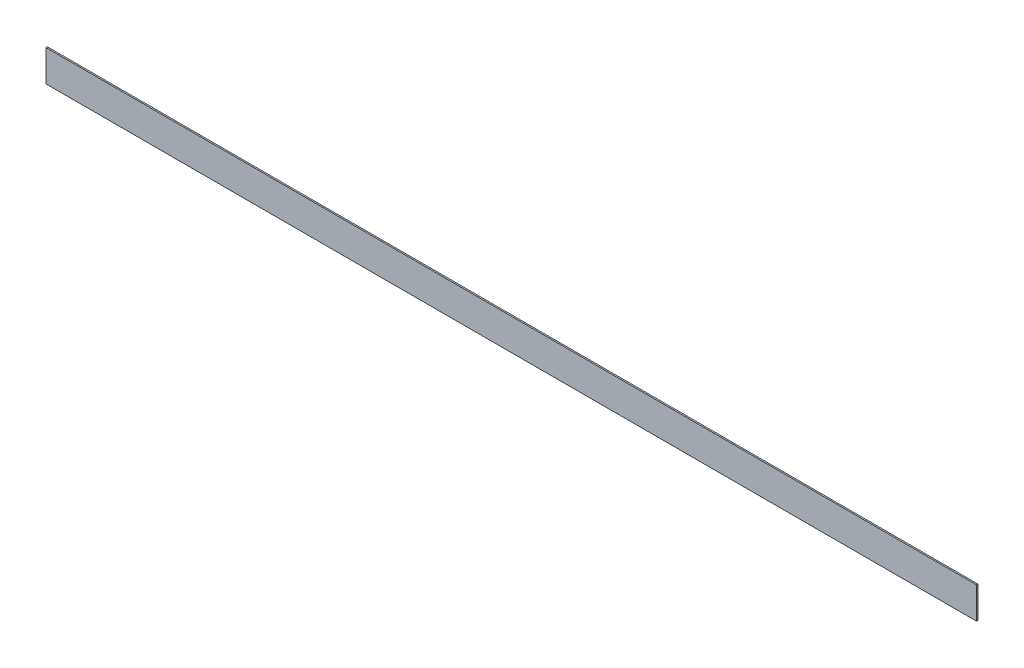
ISO-10303-21;
HEADER;
FILE_DESCRIPTION(('STEP AP214'),'2;1');
FILE_NAME('part.step','',(''),(''),'','','');
FILE_SCHEMA(('AUTOMOTIVE_DESIGN { 1 0 10303 214 1 1 1 1 }'));
ENDSEC;
DATA;
#1=APPLICATION_CONTEXT('core data for automotive mechanical design processes');
#2=APPLICATION_PROTOCOL_DEFINITION('international standard','automotive_design',2000,#1);
#3=PRODUCT_CONTEXT('',#1,'mechanical');
#4=PRODUCT('Part','Part','',(#3));
#5=PRODUCT_RELATED_PRODUCT_CATEGORY('part','',(#4));
#6=PRODUCT_DEFINITION_FORMATION('','',#4);
#7=PRODUCT_DEFINITION_CONTEXT('part definition',#1,'design');
#8=PRODUCT_DEFINITION('design','',#6,#7);
#9=PRODUCT_DEFINITION_SHAPE('','',#8);
#10=(LENGTH_UNIT() NAMED_UNIT(*) SI_UNIT(.MILLI.,.METRE.));
#11=(NAMED_UNIT(*) PLANE_ANGLE_UNIT() SI_UNIT($,.RADIAN.));
#12=(NAMED_UNIT(*) SI_UNIT($,.STERADIAN.) SOLID_ANGLE_UNIT());
#13=UNCERTAINTY_MEASURE_WITH_UNIT(LENGTH_MEASURE(1.E-05),#10,'distance_accuracy_value','');
#14=(GEOMETRIC_REPRESENTATION_CONTEXT(3) GLOBAL_UNCERTAINTY_ASSIGNED_CONTEXT((#13)) GLOBAL_UNIT_ASSIGNED_CONTEXT((#10,
#11,#12)) REPRESENTATION_CONTEXT('',''));
#15=CARTESIAN_POINT('',(0.,0.,0.));
#16=DIRECTION('',(0.,0.,1.));
#17=DIRECTION('',(1.,0.,0.));
#18=AXIS2_PLACEMENT_3D('',#15,#16,#17);
#19=CARTESIAN_POINT('',(665.5,-22.5,2.));
#20=DIRECTION('',(-1.,0.,0.));
#21=DIRECTION('',(0.,0.,1.));
#22=AXIS2_PLACEMENT_3D('',#19,#20,#21);
#23=PLANE('',#22);
#24=DIRECTION('',(0.,1.,0.));
#25=VECTOR('',#24,1.);
#26=CARTESIAN_POINT('',(665.5,-22.5,0.));
#27=LINE('',#26,#25);
#28=CARTESIAN_POINT('',(665.5,-22.5,0.));
#29=VERTEX_POINT('',#28);
#30=CARTESIAN_POINT('',(665.5,22.5,0.));
#31=VERTEX_POINT('',#30);
#32=EDGE_CURVE('E95',#29,#31,#27,.T.);
#33=ORIENTED_EDGE('',*,*,#32,.T.);
#34=DIRECTION('',(0.,0.,-1.));
#35=VECTOR('',#34,1.);
#36=CARTESIAN_POINT('',(665.5,22.5,2.));
#37=LINE('',#36,#35);
#38=CARTESIAN_POINT('',(665.5,22.5,2.));
#39=VERTEX_POINT('',#38);
#40=EDGE_CURVE('E11',#39,#31,#37,.T.);
#41=ORIENTED_EDGE('',*,*,#40,.F.);
#42=DIRECTION('',(0.,1.,0.));
#43=VECTOR('',#42,1.);
#44=CARTESIAN_POINT('',(665.5,-22.5,2.));
#45=LINE('',#44,#43);
#46=CARTESIAN_POINT('',(665.5,-22.5,2.));
#47=VERTEX_POINT('',#46);
#48=EDGE_CURVE('E83',#47,#39,#45,.T.);
#49=ORIENTED_EDGE('',*,*,#48,.F.);
#50=DIRECTION('',(0.,0.,-1.));
#51=VECTOR('',#50,1.);
#52=CARTESIAN_POINT('',(665.5,-22.5,2.));
#53=LINE('',#52,#51);
#54=EDGE_CURVE('E91',#47,#29,#53,.T.);
#55=ORIENTED_EDGE('',*,*,#54,.T.);
#56=EDGE_LOOP('',(#33,#41,#49,#55));
#57=FACE_BOUND('',#56,.T.);
#58=ADVANCED_FACE('F32',(#57),#23,.F.);
#59=CARTESIAN_POINT('',(-665.5,22.5,2.));
#60=DIRECTION('',(0.,-1.,0.));
#61=DIRECTION('',(0.,0.,-1.));
#62=AXIS2_PLACEMENT_3D('',#59,#60,#61);
#63=PLANE('',#62);
#64=DIRECTION('',(-1.,0.,0.));
#65=VECTOR('',#64,1.);
#66=CARTESIAN_POINT('',(-665.5,22.5,0.));
#67=LINE('',#66,#65);
#68=CARTESIAN_POINT('',(-665.5,22.5,0.));
#69=VERTEX_POINT('',#68);
#70=EDGE_CURVE('E87',#31,#69,#67,.T.);
#71=ORIENTED_EDGE('',*,*,#70,.T.);
#72=DIRECTION('',(0.,0.,-1.));
#73=VECTOR('',#72,1.);
#74=CARTESIAN_POINT('',(-665.5,22.5,2.));
#75=LINE('',#74,#73);
#76=CARTESIAN_POINT('',(-665.5,22.5,2.));
#77=VERTEX_POINT('',#76);
#78=EDGE_CURVE('E40',#77,#69,#75,.T.);
#79=ORIENTED_EDGE('',*,*,#78,.F.);
#80=DIRECTION('',(-1.,0.,0.));
#81=VECTOR('',#80,1.);
#82=CARTESIAN_POINT('',(-665.5,22.5,2.));
#83=LINE('',#82,#81);
#84=EDGE_CURVE('E78',#39,#77,#83,.T.);
#85=ORIENTED_EDGE('',*,*,#84,.F.);
#86=ORIENTED_EDGE('',*,*,#40,.T.);
#87=EDGE_LOOP('',(#71,#79,#85,#86));
#88=FACE_BOUND('',#87,.T.);
#89=ADVANCED_FACE('F86',(#88),#63,.F.);
#90=CARTESIAN_POINT('',(-665.5,-22.5,2.));
#91=DIRECTION('',(1.,0.,0.));
#92=DIRECTION('',(0.,0.,-1.));
#93=AXIS2_PLACEMENT_3D('',#90,#91,#92);
#94=PLANE('',#93);
#95=DIRECTION('',(0.,-1.,0.));
#96=VECTOR('',#95,1.);
#97=CARTESIAN_POINT('',(-665.5,-22.5,0.));
#98=LINE('',#97,#96);
#99=CARTESIAN_POINT('',(-665.5,-22.5,0.));
#100=VERTEX_POINT('',#99);
#101=EDGE_CURVE('E65',#69,#100,#98,.T.);
#102=ORIENTED_EDGE('',*,*,#101,.T.);
#103=DIRECTION('',(0.,0.,-1.));
#104=VECTOR('',#103,1.);
#105=CARTESIAN_POINT('',(-665.5,-22.5,2.));
#106=LINE('',#105,#104);
#107=CARTESIAN_POINT('',(-665.5,-22.5,2.));
#108=VERTEX_POINT('',#107);
#109=EDGE_CURVE('E88',#108,#100,#106,.T.);
#110=ORIENTED_EDGE('',*,*,#109,.F.);
#111=DIRECTION('',(0.,-1.,0.));
#112=VECTOR('',#111,1.);
#113=CARTESIAN_POINT('',(-665.5,-22.5,2.));
#114=LINE('',#113,#112);
#115=EDGE_CURVE('E81',#77,#108,#114,.T.);
#116=ORIENTED_EDGE('',*,*,#115,.F.);
#117=ORIENTED_EDGE('',*,*,#78,.T.);
#118=EDGE_LOOP('',(#102,#110,#116,#117));
#119=FACE_BOUND('',#118,.T.);
#120=ADVANCED_FACE('F89',(#119),#94,.F.);
#121=CARTESIAN_POINT('',(-665.5,-22.5,2.));
#122=DIRECTION('',(0.,1.,0.));
#123=DIRECTION('',(0.,0.,1.));
#124=AXIS2_PLACEMENT_3D('',#121,#122,#123);
#125=PLANE('',#124);
#126=DIRECTION('',(1.,0.,0.));
#127=VECTOR('',#126,1.);
#128=CARTESIAN_POINT('',(-665.5,-22.5,0.));
#129=LINE('',#128,#127);
#130=EDGE_CURVE('E71',#100,#29,#129,.T.);
#131=ORIENTED_EDGE('',*,*,#130,.T.);
#132=ORIENTED_EDGE('',*,*,#54,.F.);
#133=DIRECTION('',(1.,0.,0.));
#134=VECTOR('',#133,1.);
#135=CARTESIAN_POINT('',(-665.5,-22.5,2.));
#136=LINE('',#135,#134);
#137=EDGE_CURVE('E48',#108,#47,#136,.T.);
#138=ORIENTED_EDGE('',*,*,#137,.F.);
#139=ORIENTED_EDGE('',*,*,#109,.T.);
#140=EDGE_LOOP('',(#131,#132,#138,#139));
#141=FACE_BOUND('',#140,.T.);
#142=ADVANCED_FACE('F102',(#141),#125,.F.);
#143=CARTESIAN_POINT('',(0.,0.,2.));
#144=DIRECTION('',(0.,0.,-1.));
#145=DIRECTION('',(-1.,0.,0.));
#146=AXIS2_PLACEMENT_3D('',#143,#144,#145);
#147=PLANE('',#146);
#148=ORIENTED_EDGE('',*,*,#48,.T.);
#149=ORIENTED_EDGE('',*,*,#84,.T.);
#150=ORIENTED_EDGE('',*,*,#115,.T.);
#151=ORIENTED_EDGE('',*,*,#137,.T.);
#152=EDGE_LOOP('',(#148,#149,#150,#151));
#153=FACE_BOUND('',#152,.T.);
#154=ADVANCED_FACE('F79',(#153),#147,.F.);
#155=CARTESIAN_POINT('',(0.,0.,0.));
#156=DIRECTION('',(0.,0.,-1.));
#157=DIRECTION('',(-1.,0.,0.));
#158=AXIS2_PLACEMENT_3D('',#155,#156,#157);
#159=PLANE('',#158);
#160=ORIENTED_EDGE('',*,*,#32,.F.);
#161=ORIENTED_EDGE('',*,*,#130,.F.);
#162=ORIENTED_EDGE('',*,*,#101,.F.);
#163=ORIENTED_EDGE('',*,*,#70,.F.);
#164=EDGE_LOOP('',(#160,#161,#162,#163));
#165=FACE_BOUND('',#164,.T.);
#166=ADVANCED_FACE('F105',(#165),#159,.T.);
#167=CLOSED_SHELL('',(#58,#89,#120,#142,#154,#166));
#168=MANIFOLD_SOLID_BREP('B2',#167);
#169=ADVANCED_BREP_SHAPE_REPRESENTATION('',(#18,#168),#14);
#170=SHAPE_DEFINITION_REPRESENTATION(#9,#169);
ENDSEC;
END-ISO-10303-21;
